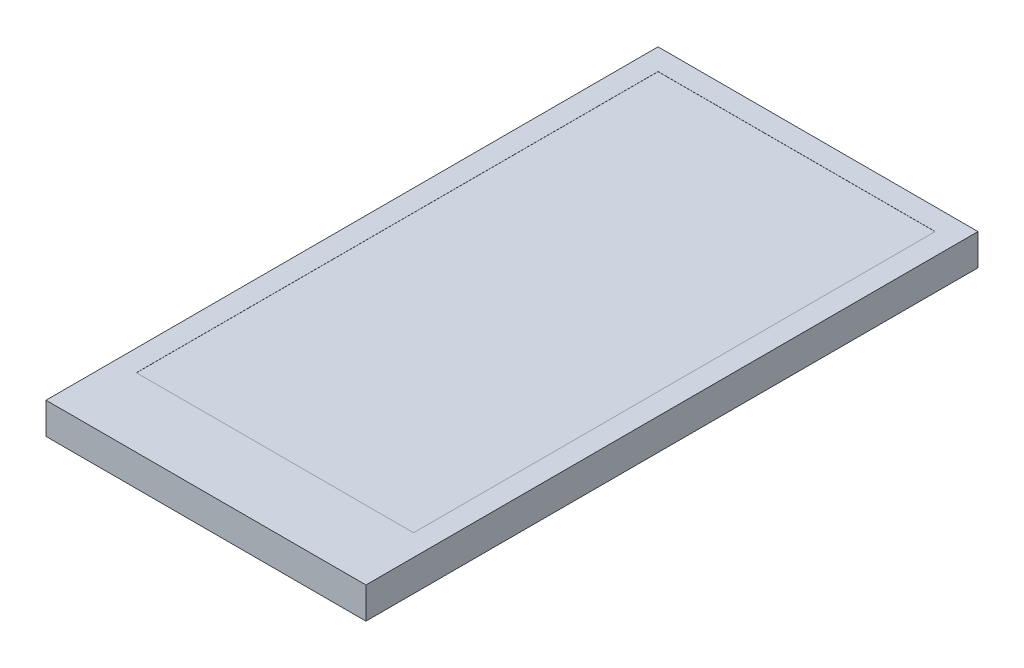
ISO-10303-21;
HEADER;
FILE_DESCRIPTION(('STEP AP214'),'2;1');
FILE_NAME('part.step','',(''),(''),'','','');
FILE_SCHEMA(('AUTOMOTIVE_DESIGN { 1 0 10303 214 1 1 1 1 }'));
ENDSEC;
DATA;
#1=APPLICATION_CONTEXT('core data for automotive mechanical design processes');
#2=APPLICATION_PROTOCOL_DEFINITION('international standard','automotive_design',2000,#1);
#3=PRODUCT_CONTEXT('',#1,'mechanical');
#4=PRODUCT('Part','Part','',(#3));
#5=PRODUCT_RELATED_PRODUCT_CATEGORY('part','',(#4));
#6=PRODUCT_DEFINITION_FORMATION('','',#4);
#7=PRODUCT_DEFINITION_CONTEXT('part definition',#1,'design');
#8=PRODUCT_DEFINITION('design','',#6,#7);
#9=PRODUCT_DEFINITION_SHAPE('','',#8);
#10=(LENGTH_UNIT() NAMED_UNIT(*) SI_UNIT(.MILLI.,.METRE.));
#11=(NAMED_UNIT(*) PLANE_ANGLE_UNIT() SI_UNIT($,.RADIAN.));
#12=(NAMED_UNIT(*) SI_UNIT($,.STERADIAN.) SOLID_ANGLE_UNIT());
#13=UNCERTAINTY_MEASURE_WITH_UNIT(LENGTH_MEASURE(1.E-05),#10,'distance_accuracy_value','');
#14=(GEOMETRIC_REPRESENTATION_CONTEXT(3) GLOBAL_UNCERTAINTY_ASSIGNED_CONTEXT((#13)) GLOBAL_UNIT_ASSIGNED_CONTEXT((#10,
#11,#12)) REPRESENTATION_CONTEXT('',''));
#15=CARTESIAN_POINT('',(0.,0.,0.));
#16=DIRECTION('',(0.,0.,1.));
#17=DIRECTION('',(1.,0.,0.));
#18=AXIS2_PLACEMENT_3D('',#15,#16,#17);
#19=CARTESIAN_POINT('',(49.0741558129696,2.57,50.12));
#20=DIRECTION('',(1.,0.,0.));
#21=DIRECTION('',(0.,0.,-1.));
#22=AXIS2_PLACEMENT_3D('',#19,#20,#21);
#23=PLANE('',#22);
#24=DIRECTION('',(0.,0.,1.));
#25=VECTOR('',#24,1.);
#26=CARTESIAN_POINT('',(49.0741558129696,0.,50.12));
#27=LINE('',#26,#25);
#28=CARTESIAN_POINT('',(49.0741558129696,0.,0.));
#29=VERTEX_POINT('',#28);
#30=CARTESIAN_POINT('',(49.0741558129696,0.,50.12));
#31=VERTEX_POINT('',#30);
#32=EDGE_CURVE('E145',#29,#31,#27,.T.);
#33=ORIENTED_EDGE('',*,*,#32,.T.);
#34=DIRECTION('',(0.,-1.,0.));
#35=VECTOR('',#34,1.);
#36=CARTESIAN_POINT('',(49.0741558129696,2.57,50.12));
#37=LINE('',#36,#35);
#38=CARTESIAN_POINT('',(49.0741558129696,2.57,50.12));
#39=VERTEX_POINT('',#38);
#40=EDGE_CURVE('E11',#39,#31,#37,.T.);
#41=ORIENTED_EDGE('',*,*,#40,.F.);
#42=DIRECTION('',(0.,0.,1.));
#43=VECTOR('',#42,1.);
#44=CARTESIAN_POINT('',(49.0741558129696,2.57,50.12));
#45=LINE('',#44,#43);
#46=CARTESIAN_POINT('',(49.0741558129696,2.57,0.));
#47=VERTEX_POINT('',#46);
#48=EDGE_CURVE('E149',#47,#39,#45,.T.);
#49=ORIENTED_EDGE('',*,*,#48,.F.);
#50=DIRECTION('',(0.,-1.,0.));
#51=VECTOR('',#50,1.);
#52=CARTESIAN_POINT('',(49.0741558129696,2.57,0.));
#53=LINE('',#52,#51);
#54=EDGE_CURVE('E155',#47,#29,#53,.T.);
#55=ORIENTED_EDGE('',*,*,#54,.T.);
#56=EDGE_LOOP('',(#33,#41,#49,#55));
#57=FACE_BOUND('',#56,.T.);
#58=ADVANCED_FACE('F37',(#57),#23,.F.);
#59=CARTESIAN_POINT('',(75.2741558129696,2.57,50.12));
#60=DIRECTION('',(0.,0.,-1.));
#61=DIRECTION('',(-1.,0.,0.));
#62=AXIS2_PLACEMENT_3D('',#59,#60,#61);
#63=PLANE('',#62);
#64=DIRECTION('',(1.,0.,0.));
#65=VECTOR('',#64,1.);
#66=CARTESIAN_POINT('',(75.2741558129696,0.,50.12));
#67=LINE('',#66,#65);
#68=CARTESIAN_POINT('',(75.2741558129696,0.,50.12));
#69=VERTEX_POINT('',#68);
#70=EDGE_CURVE('E158',#31,#69,#67,.T.);
#71=ORIENTED_EDGE('',*,*,#70,.T.);
#72=DIRECTION('',(0.,-1.,0.));
#73=VECTOR('',#72,1.);
#74=CARTESIAN_POINT('',(75.2741558129696,2.57,50.12));
#75=LINE('',#74,#73);
#76=CARTESIAN_POINT('',(75.2741558129696,2.57,50.12));
#77=VERTEX_POINT('',#76);
#78=EDGE_CURVE('E44',#77,#69,#75,.T.);
#79=ORIENTED_EDGE('',*,*,#78,.F.);
#80=DIRECTION('',(1.,0.,0.));
#81=VECTOR('',#80,1.);
#82=CARTESIAN_POINT('',(75.2741558129696,2.57,50.12));
#83=LINE('',#82,#81);
#84=EDGE_CURVE('E88',#39,#77,#83,.T.);
#85=ORIENTED_EDGE('',*,*,#84,.F.);
#86=ORIENTED_EDGE('',*,*,#40,.T.);
#87=EDGE_LOOP('',(#71,#79,#85,#86));
#88=FACE_BOUND('',#87,.T.);
#89=ADVANCED_FACE('F187',(#88),#63,.F.);
#90=CARTESIAN_POINT('',(75.2741558129696,2.57,0.));
#91=DIRECTION('',(-1.,0.,0.));
#92=DIRECTION('',(0.,0.,1.));
#93=AXIS2_PLACEMENT_3D('',#90,#91,#92);
#94=PLANE('',#93);
#95=DIRECTION('',(0.,0.,-1.));
#96=VECTOR('',#95,1.);
#97=CARTESIAN_POINT('',(75.2741558129696,0.,0.));
#98=LINE('',#97,#96);
#99=CARTESIAN_POINT('',(75.2741558129696,0.,0.));
#100=VERTEX_POINT('',#99);
#101=EDGE_CURVE('E160',#69,#100,#98,.T.);
#102=ORIENTED_EDGE('',*,*,#101,.T.);
#103=DIRECTION('',(0.,-1.,0.));
#104=VECTOR('',#103,1.);
#105=CARTESIAN_POINT('',(75.2741558129696,2.57,0.));
#106=LINE('',#105,#104);
#107=CARTESIAN_POINT('',(75.2741558129696,2.57,0.));
#108=VERTEX_POINT('',#107);
#109=EDGE_CURVE('E164',#108,#100,#106,.T.);
#110=ORIENTED_EDGE('',*,*,#109,.F.);
#111=DIRECTION('',(0.,0.,-1.));
#112=VECTOR('',#111,1.);
#113=CARTESIAN_POINT('',(75.2741558129696,2.57,0.));
#114=LINE('',#113,#112);
#115=EDGE_CURVE('E152',#77,#108,#114,.T.);
#116=ORIENTED_EDGE('',*,*,#115,.F.);
#117=ORIENTED_EDGE('',*,*,#78,.T.);
#118=EDGE_LOOP('',(#102,#110,#116,#117));
#119=FACE_BOUND('',#118,.T.);
#120=ADVANCED_FACE('F169',(#119),#94,.F.);
#121=CARTESIAN_POINT('',(49.0741558129696,2.57,0.));
#122=DIRECTION('',(0.,0.,1.));
#123=DIRECTION('',(1.,0.,0.));
#124=AXIS2_PLACEMENT_3D('',#121,#122,#123);
#125=PLANE('',#124);
#126=DIRECTION('',(-1.,0.,0.));
#127=VECTOR('',#126,1.);
#128=CARTESIAN_POINT('',(49.0741558129696,0.,0.));
#129=LINE('',#128,#127);
#130=EDGE_CURVE('E81',#100,#29,#129,.T.);
#131=ORIENTED_EDGE('',*,*,#130,.T.);
#132=ORIENTED_EDGE('',*,*,#54,.F.);
#133=DIRECTION('',(-1.,0.,0.));
#134=VECTOR('',#133,1.);
#135=CARTESIAN_POINT('',(49.0741558129696,2.57,0.));
#136=LINE('',#135,#134);
#137=EDGE_CURVE('E60',#108,#47,#136,.T.);
#138=ORIENTED_EDGE('',*,*,#137,.F.);
#139=ORIENTED_EDGE('',*,*,#109,.T.);
#140=EDGE_LOOP('',(#131,#132,#138,#139));
#141=FACE_BOUND('',#140,.T.);
#142=ADVANCED_FACE('F177',(#141),#125,.F.);
#143=CARTESIAN_POINT('',(0.,2.57,0.));
#144=DIRECTION('',(0.,-1.,0.));
#145=DIRECTION('',(0.,0.,-1.));
#146=AXIS2_PLACEMENT_3D('',#143,#144,#145);
#147=PLANE('',#146);
#148=DIRECTION('',(1.,0.,0.));
#149=VECTOR('',#148,1.);
#150=CARTESIAN_POINT('',(73.5241558129696,2.57,44.47));
#151=LINE('',#150,#149);
#152=CARTESIAN_POINT('',(50.8241558129696,2.57,44.47));
#153=VERTEX_POINT('',#152);
#154=CARTESIAN_POINT('',(73.5241558129696,2.57,44.47));
#155=VERTEX_POINT('',#154);
#156=EDGE_CURVE('E139',#153,#155,#151,.T.);
#157=ORIENTED_EDGE('',*,*,#156,.F.);
#158=DIRECTION('',(0.,0.,1.));
#159=VECTOR('',#158,1.);
#160=CARTESIAN_POINT('',(50.8241558129696,2.57,44.47));
#161=LINE('',#160,#159);
#162=CARTESIAN_POINT('',(50.8241558129696,2.57,1.75));
#163=VERTEX_POINT('',#162);
#164=EDGE_CURVE('E51',#163,#153,#161,.T.);
#165=ORIENTED_EDGE('',*,*,#164,.F.);
#166=DIRECTION('',(-1.,0.,0.));
#167=VECTOR('',#166,1.);
#168=CARTESIAN_POINT('',(50.8241558129696,2.57,1.75));
#169=LINE('',#168,#167);
#170=CARTESIAN_POINT('',(73.5241558129696,2.57,1.75));
#171=VERTEX_POINT('',#170);
#172=EDGE_CURVE('E130',#171,#163,#169,.T.);
#173=ORIENTED_EDGE('',*,*,#172,.F.);
#174=DIRECTION('',(0.,0.,-1.));
#175=VECTOR('',#174,1.);
#176=CARTESIAN_POINT('',(73.5241558129696,2.57,1.75));
#177=LINE('',#176,#175);
#178=EDGE_CURVE('E133',#155,#171,#177,.T.);
#179=ORIENTED_EDGE('',*,*,#178,.F.);
#180=EDGE_LOOP('',(#157,#165,#173,#179));
#181=FACE_BOUND('',#180,.T.);
#182=ORIENTED_EDGE('',*,*,#48,.T.);
#183=ORIENTED_EDGE('',*,*,#84,.T.);
#184=ORIENTED_EDGE('',*,*,#115,.T.);
#185=ORIENTED_EDGE('',*,*,#137,.T.);
#186=EDGE_LOOP('',(#182,#183,#184,#185));
#187=FACE_BOUND('',#186,.T.);
#188=ADVANCED_FACE('F179',(#181,#187),#147,.F.);
#189=CARTESIAN_POINT('',(0.,0.,0.));
#190=DIRECTION('',(0.,-1.,0.));
#191=DIRECTION('',(0.,0.,-1.));
#192=AXIS2_PLACEMENT_3D('',#189,#190,#191);
#193=PLANE('',#192);
#194=ORIENTED_EDGE('',*,*,#32,.F.);
#195=ORIENTED_EDGE('',*,*,#130,.F.);
#196=ORIENTED_EDGE('',*,*,#101,.F.);
#197=ORIENTED_EDGE('',*,*,#70,.F.);
#198=EDGE_LOOP('',(#194,#195,#196,#197));
#199=FACE_BOUND('',#198,.T.);
#200=ADVANCED_FACE('F173',(#199),#193,.T.);
#201=CARTESIAN_POINT('',(50.8241558129696,2.56,44.47));
#202=DIRECTION('',(-1.,0.,0.));
#203=DIRECTION('',(0.,0.,1.));
#204=AXIS2_PLACEMENT_3D('',#201,#202,#203);
#205=PLANE('',#204);
#206=ORIENTED_EDGE('',*,*,#164,.T.);
#207=DIRECTION('',(0.,1.,0.));
#208=VECTOR('',#207,1.);
#209=CARTESIAN_POINT('',(50.8241558129696,2.56,44.47));
#210=LINE('',#209,#208);
#211=CARTESIAN_POINT('',(50.8241558129696,2.56,44.47));
#212=VERTEX_POINT('',#211);
#213=EDGE_CURVE('E108',#212,#153,#210,.T.);
#214=ORIENTED_EDGE('',*,*,#213,.F.);
#215=DIRECTION('',(0.,0.,1.));
#216=VECTOR('',#215,1.);
#217=CARTESIAN_POINT('',(50.8241558129696,2.56,44.47));
#218=LINE('',#217,#216);
#219=CARTESIAN_POINT('',(50.8241558129696,2.56,1.75));
#220=VERTEX_POINT('',#219);
#221=EDGE_CURVE('E112',#220,#212,#218,.T.);
#222=ORIENTED_EDGE('',*,*,#221,.F.);
#223=DIRECTION('',(0.,1.,0.));
#224=VECTOR('',#223,1.);
#225=CARTESIAN_POINT('',(50.8241558129696,2.56,1.75));
#226=LINE('',#225,#224);
#227=EDGE_CURVE('E143',#220,#163,#226,.T.);
#228=ORIENTED_EDGE('',*,*,#227,.T.);
#229=EDGE_LOOP('',(#206,#214,#222,#228));
#230=FACE_BOUND('',#229,.T.);
#231=ADVANCED_FACE('F110',(#230),#205,.F.);
#232=CARTESIAN_POINT('',(50.8241558129696,2.56,1.75));
#233=DIRECTION('',(0.,0.,-1.));
#234=DIRECTION('',(-1.,0.,0.));
#235=AXIS2_PLACEMENT_3D('',#232,#233,#234);
#236=PLANE('',#235);
#237=ORIENTED_EDGE('',*,*,#172,.T.);
#238=ORIENTED_EDGE('',*,*,#227,.F.);
#239=DIRECTION('',(-1.,0.,0.));
#240=VECTOR('',#239,1.);
#241=CARTESIAN_POINT('',(50.8241558129696,2.56,1.75));
#242=LINE('',#241,#240);
#243=CARTESIAN_POINT('',(73.5241558129696,2.56,1.75));
#244=VERTEX_POINT('',#243);
#245=EDGE_CURVE('E118',#244,#220,#242,.T.);
#246=ORIENTED_EDGE('',*,*,#245,.F.);
#247=DIRECTION('',(0.,1.,0.));
#248=VECTOR('',#247,1.);
#249=CARTESIAN_POINT('',(73.5241558129696,2.56,1.75));
#250=LINE('',#249,#248);
#251=EDGE_CURVE('E146',#244,#171,#250,.T.);
#252=ORIENTED_EDGE('',*,*,#251,.T.);
#253=EDGE_LOOP('',(#237,#238,#246,#252));
#254=FACE_BOUND('',#253,.T.);
#255=ADVANCED_FACE('F231',(#254),#236,.F.);
#256=CARTESIAN_POINT('',(73.5241558129696,2.56,1.75));
#257=DIRECTION('',(1.,0.,0.));
#258=DIRECTION('',(0.,0.,-1.));
#259=AXIS2_PLACEMENT_3D('',#256,#257,#258);
#260=PLANE('',#259);
#261=ORIENTED_EDGE('',*,*,#178,.T.);
#262=ORIENTED_EDGE('',*,*,#251,.F.);
#263=DIRECTION('',(0.,0.,-1.));
#264=VECTOR('',#263,1.);
#265=CARTESIAN_POINT('',(73.5241558129696,2.56,1.75));
#266=LINE('',#265,#264);
#267=CARTESIAN_POINT('',(73.5241558129696,2.56,44.47));
#268=VERTEX_POINT('',#267);
#269=EDGE_CURVE('E126',#268,#244,#266,.T.);
#270=ORIENTED_EDGE('',*,*,#269,.F.);
#271=DIRECTION('',(0.,1.,0.));
#272=VECTOR('',#271,1.);
#273=CARTESIAN_POINT('',(73.5241558129696,2.56,44.47));
#274=LINE('',#273,#272);
#275=EDGE_CURVE('E117',#268,#155,#274,.T.);
#276=ORIENTED_EDGE('',*,*,#275,.T.);
#277=EDGE_LOOP('',(#261,#262,#270,#276));
#278=FACE_BOUND('',#277,.T.);
#279=ADVANCED_FACE('F240',(#278),#260,.F.);
#280=CARTESIAN_POINT('',(73.5241558129696,2.56,44.47));
#281=DIRECTION('',(0.,0.,1.));
#282=DIRECTION('',(1.,0.,0.));
#283=AXIS2_PLACEMENT_3D('',#280,#281,#282);
#284=PLANE('',#283);
#285=ORIENTED_EDGE('',*,*,#156,.T.);
#286=ORIENTED_EDGE('',*,*,#275,.F.);
#287=DIRECTION('',(1.,0.,0.));
#288=VECTOR('',#287,1.);
#289=CARTESIAN_POINT('',(73.5241558129696,2.56,44.47));
#290=LINE('',#289,#288);
#291=EDGE_CURVE('E121',#212,#268,#290,.T.);
#292=ORIENTED_EDGE('',*,*,#291,.F.);
#293=ORIENTED_EDGE('',*,*,#213,.T.);
#294=EDGE_LOOP('',(#285,#286,#292,#293));
#295=FACE_BOUND('',#294,.T.);
#296=ADVANCED_FACE('F122',(#295),#284,.F.);
#297=CARTESIAN_POINT('',(0.,2.56,0.));
#298=DIRECTION('',(0.,-1.,0.));
#299=DIRECTION('',(0.,0.,-1.));
#300=AXIS2_PLACEMENT_3D('',#297,#298,#299);
#301=PLANE('',#300);
#302=ORIENTED_EDGE('',*,*,#221,.T.);
#303=ORIENTED_EDGE('',*,*,#291,.T.);
#304=ORIENTED_EDGE('',*,*,#269,.T.);
#305=ORIENTED_EDGE('',*,*,#245,.T.);
#306=EDGE_LOOP('',(#302,#303,#304,#305));
#307=FACE_BOUND('',#306,.T.);
#308=ADVANCED_FACE('F128',(#307),#301,.F.);
#309=CLOSED_SHELL('',(#58,#89,#120,#142,#188,#200,#231,#255,#279,#296,#308));
#310=MANIFOLD_SOLID_BREP('B2',#309);
#311=ADVANCED_BREP_SHAPE_REPRESENTATION('',(#18,#310),#14);
#312=SHAPE_DEFINITION_REPRESENTATION(#9,#311);
ENDSEC;
END-ISO-10303-21;
